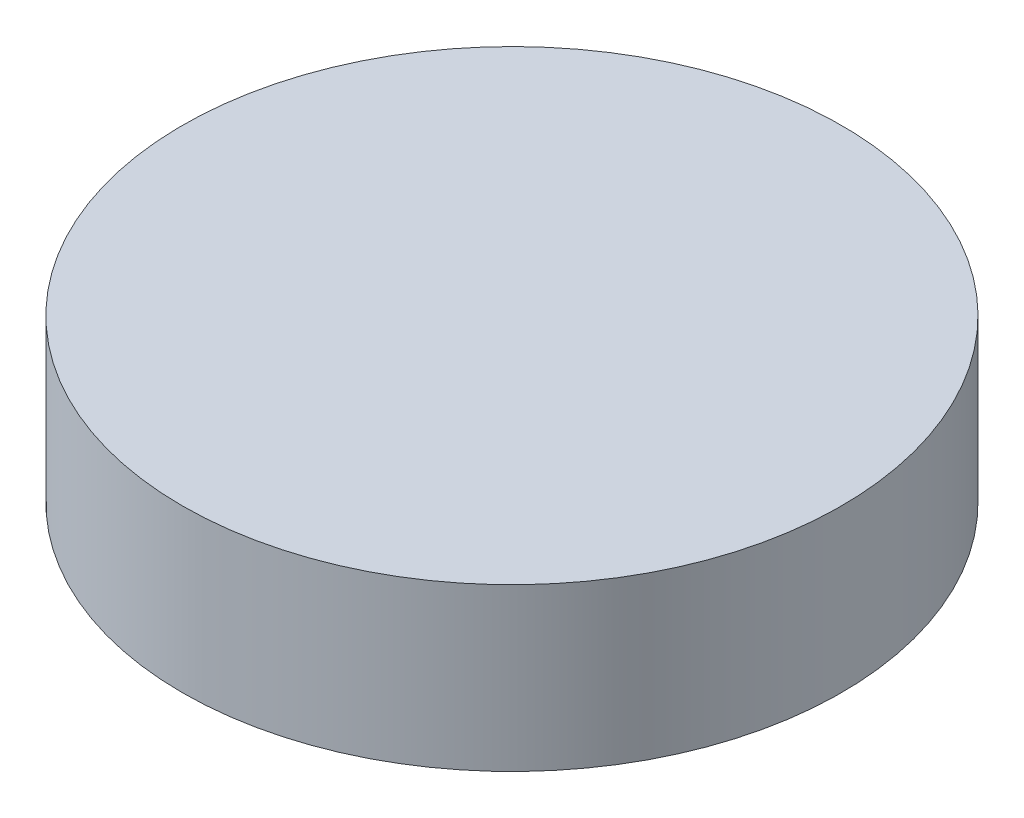
ISO-10303-21;
HEADER;
FILE_DESCRIPTION(('STEP AP214'),'2;1');
FILE_NAME('part.step','',(''),(''),'','','');
FILE_SCHEMA(('AUTOMOTIVE_DESIGN { 1 0 10303 214 1 1 1 1 }'));
ENDSEC;
DATA;
#1=APPLICATION_CONTEXT('core data for automotive mechanical design processes');
#2=APPLICATION_PROTOCOL_DEFINITION('international standard','automotive_design',2000,#1);
#3=PRODUCT_CONTEXT('',#1,'mechanical');
#4=PRODUCT('Part','Part','',(#3));
#5=PRODUCT_RELATED_PRODUCT_CATEGORY('part','',(#4));
#6=PRODUCT_DEFINITION_FORMATION('','',#4);
#7=PRODUCT_DEFINITION_CONTEXT('part definition',#1,'design');
#8=PRODUCT_DEFINITION('design','',#6,#7);
#9=PRODUCT_DEFINITION_SHAPE('','',#8);
#10=(LENGTH_UNIT() NAMED_UNIT(*) SI_UNIT(.MILLI.,.METRE.));
#11=(NAMED_UNIT(*) PLANE_ANGLE_UNIT() SI_UNIT($,.RADIAN.));
#12=(NAMED_UNIT(*) SI_UNIT($,.STERADIAN.) SOLID_ANGLE_UNIT());
#13=UNCERTAINTY_MEASURE_WITH_UNIT(LENGTH_MEASURE(1.E-05),#10,'distance_accuracy_value','');
#14=(GEOMETRIC_REPRESENTATION_CONTEXT(3) GLOBAL_UNCERTAINTY_ASSIGNED_CONTEXT((#13)) GLOBAL_UNIT_ASSIGNED_CONTEXT((#10,
#11,#12)) REPRESENTATION_CONTEXT('',''));
#15=CARTESIAN_POINT('',(0.,0.,0.));
#16=DIRECTION('',(0.,0.,1.));
#17=DIRECTION('',(1.,0.,0.));
#18=AXIS2_PLACEMENT_3D('',#15,#16,#17);
#19=CARTESIAN_POINT('',(0.,54.,0.));
#20=DIRECTION('',(0.,-1.,0.));
#21=DIRECTION('',(0.,0.,-1.));
#22=AXIS2_PLACEMENT_3D('',#19,#20,#21);
#23=CYLINDRICAL_SURFACE('',#22,110.);
#24=CARTESIAN_POINT('',(0.,54.,0.));
#25=DIRECTION('',(0.,1.,0.));
#26=DIRECTION('',(0.,0.,1.));
#27=AXIS2_PLACEMENT_3D('',#24,#25,#26);
#28=CIRCLE('',#27,110.);
#29=CARTESIAN_POINT('',(0.,54.,110.));
#30=VERTEX_POINT('',#29);
#31=EDGE_CURVE('E10',#30,#30,#28,.T.);
#32=ORIENTED_EDGE('',*,*,#31,.F.);
#33=EDGE_LOOP('',(#32));
#34=FACE_BOUND('',#33,.T.);
#35=CARTESIAN_POINT('',(0.,0.,0.));
#36=DIRECTION('',(0.,1.,0.));
#37=DIRECTION('',(0.,0.,1.));
#38=AXIS2_PLACEMENT_3D('',#35,#36,#37);
#39=CIRCLE('',#38,110.);
#40=CARTESIAN_POINT('',(0.,0.,110.));
#41=VERTEX_POINT('',#40);
#42=EDGE_CURVE('E34',#41,#41,#39,.T.);
#43=ORIENTED_EDGE('',*,*,#42,.T.);
#44=EDGE_LOOP('',(#43));
#45=FACE_BOUND('',#44,.T.);
#46=ADVANCED_FACE('F31',(#34,#45),#23,.T.);
#47=CARTESIAN_POINT('',(0.,54.,0.));
#48=DIRECTION('',(0.,1.,0.));
#49=DIRECTION('',(0.,0.,1.));
#50=AXIS2_PLACEMENT_3D('',#47,#48,#49);
#51=PLANE('',#50);
#52=ORIENTED_EDGE('',*,*,#31,.T.);
#53=EDGE_LOOP('',(#52));
#54=FACE_BOUND('',#53,.T.);
#55=ADVANCED_FACE('F46',(#54),#51,.T.);
#56=CARTESIAN_POINT('',(0.,0.,0.));
#57=DIRECTION('',(0.,1.,0.));
#58=DIRECTION('',(0.,0.,1.));
#59=AXIS2_PLACEMENT_3D('',#56,#57,#58);
#60=PLANE('',#59);
#61=ORIENTED_EDGE('',*,*,#42,.F.);
#62=EDGE_LOOP('',(#61));
#63=FACE_BOUND('',#62,.T.);
#64=ADVANCED_FACE('F44',(#63),#60,.F.);
#65=CLOSED_SHELL('',(#46,#55,#64));
#66=MANIFOLD_SOLID_BREP('B2',#65);
#67=ADVANCED_BREP_SHAPE_REPRESENTATION('',(#18,#66),#14);
#68=SHAPE_DEFINITION_REPRESENTATION(#9,#67);
ENDSEC;
END-ISO-10303-21;
